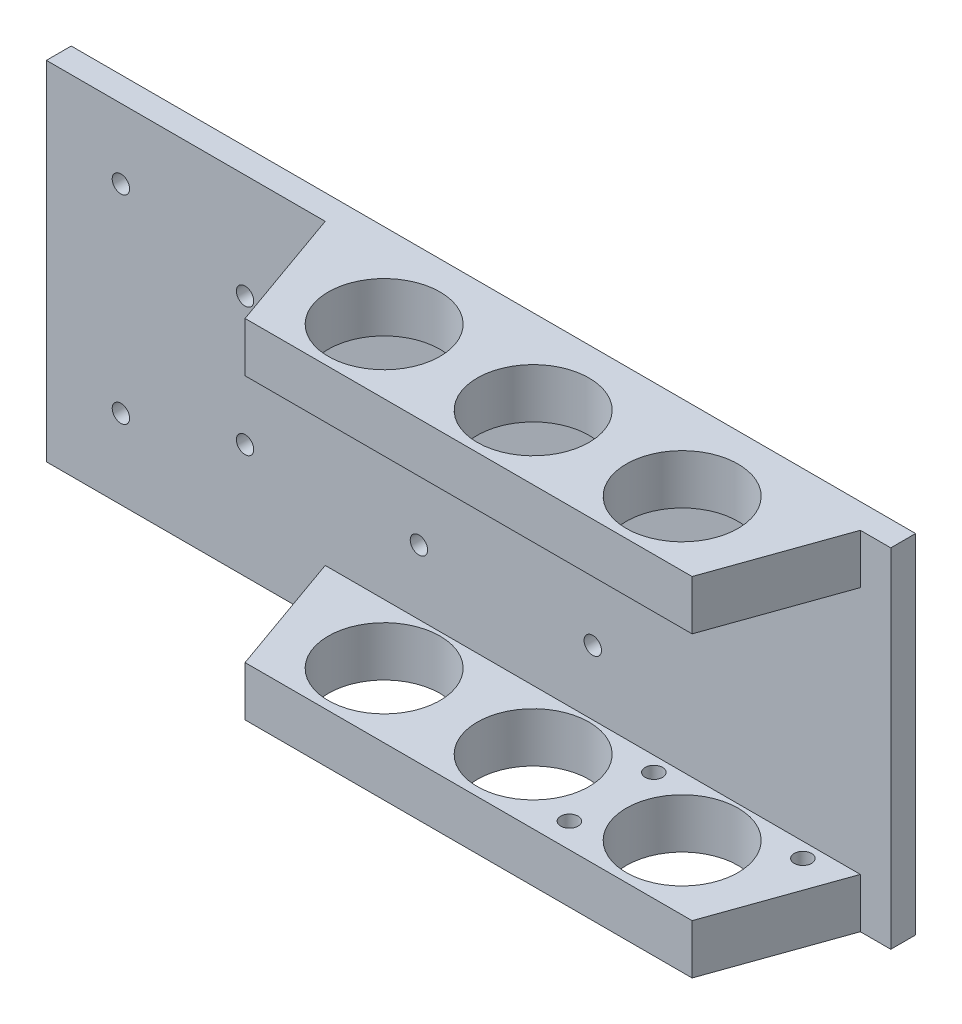
ISO-10303-21;
HEADER;
FILE_DESCRIPTION(('STEP AP214'),'2;1');
FILE_NAME('part.step','',(''),(''),'','','');
FILE_SCHEMA(('AUTOMOTIVE_DESIGN { 1 0 10303 214 1 1 1 1 }'));
ENDSEC;
DATA;
#1=APPLICATION_CONTEXT('core data for automotive mechanical design processes');
#2=APPLICATION_PROTOCOL_DEFINITION('international standard','automotive_design',2000,#1);
#3=PRODUCT_CONTEXT('',#1,'mechanical');
#4=PRODUCT('Part','Part','',(#3));
#5=PRODUCT_RELATED_PRODUCT_CATEGORY('part','',(#4));
#6=PRODUCT_DEFINITION_FORMATION('','',#4);
#7=PRODUCT_DEFINITION_CONTEXT('part definition',#1,'design');
#8=PRODUCT_DEFINITION('design','',#6,#7);
#9=PRODUCT_DEFINITION_SHAPE('','',#8);
#10=(LENGTH_UNIT() NAMED_UNIT(*) SI_UNIT(.MILLI.,.METRE.));
#11=(NAMED_UNIT(*) PLANE_ANGLE_UNIT() SI_UNIT($,.RADIAN.));
#12=(NAMED_UNIT(*) SI_UNIT($,.STERADIAN.) SOLID_ANGLE_UNIT());
#13=UNCERTAINTY_MEASURE_WITH_UNIT(LENGTH_MEASURE(1.E-05),#10,'distance_accuracy_value','');
#14=(GEOMETRIC_REPRESENTATION_CONTEXT(3) GLOBAL_UNCERTAINTY_ASSIGNED_CONTEXT((#13)) GLOBAL_UNIT_ASSIGNED_CONTEXT((#10,
#11,#12)) REPRESENTATION_CONTEXT('',''));
#15=CARTESIAN_POINT('',(0.,0.,0.));
#16=DIRECTION('',(0.,0.,1.));
#17=DIRECTION('',(1.,0.,0.));
#18=AXIS2_PLACEMENT_3D('',#15,#16,#17);
#19=CARTESIAN_POINT('',(-53.8704428508277,35.,2.5));
#20=DIRECTION('',(0.942433981333978,0.,-0.334392270884044));
#21=DIRECTION('',(-0.334392270884044,0.,-0.942433981333978));
#22=AXIS2_PLACEMENT_3D('',#19,#20,#21);
#23=PLANE('',#22);
#24=DIRECTION('',(0.,-1.,0.));
#25=VECTOR('',#24,1.);
#26=CARTESIAN_POINT('',(-53.8704428508277,35.,2.5));
#27=LINE('',#26,#25);
#28=CARTESIAN_POINT('',(-53.8704428508277,35.,2.5));
#29=VERTEX_POINT('',#28);
#30=CARTESIAN_POINT('',(-53.8704428508277,25.,2.50000000000015));
#31=VERTEX_POINT('',#30);
#32=EDGE_CURVE('E52',#29,#31,#27,.T.);
#33=ORIENTED_EDGE('',*,*,#32,.T.);
#34=DIRECTION('',(0.334392270884044,0.,0.942433981333978));
#35=VECTOR('',#34,1.);
#36=CARTESIAN_POINT('',(-53.8704428508277,25.,2.5));
#37=LINE('',#36,#35);
#38=CARTESIAN_POINT('',(-45.,25.,27.5000000000001));
#39=VERTEX_POINT('',#38);
#40=EDGE_CURVE('E257',#31,#39,#37,.T.);
#41=ORIENTED_EDGE('',*,*,#40,.T.);
#42=DIRECTION('',(0.,-1.,0.));
#43=VECTOR('',#42,1.);
#44=CARTESIAN_POINT('',(-45.,35.,27.5));
#45=LINE('',#44,#43);
#46=CARTESIAN_POINT('',(-45.,35.,27.5));
#47=VERTEX_POINT('',#46);
#48=EDGE_CURVE('E169',#47,#39,#45,.T.);
#49=ORIENTED_EDGE('',*,*,#48,.F.);
#50=DIRECTION('',(0.334392270884044,0.,0.942433981333978));
#51=VECTOR('',#50,1.);
#52=CARTESIAN_POINT('',(-53.8704428508277,35.,2.5));
#53=LINE('',#52,#51);
#54=EDGE_CURVE('E121',#29,#47,#53,.T.);
#55=ORIENTED_EDGE('',*,*,#54,.F.);
#56=EDGE_LOOP('',(#33,#41,#49,#55));
#57=FACE_BOUND('',#56,.T.);
#58=ADVANCED_FACE('F43',(#57),#23,.F.);
#59=CARTESIAN_POINT('',(45.,35.,27.5));
#60=DIRECTION('',(0.,0.,-1.));
#61=DIRECTION('',(-1.,0.,0.));
#62=AXIS2_PLACEMENT_3D('',#59,#60,#61);
#63=PLANE('',#62);
#64=ORIENTED_EDGE('',*,*,#48,.T.);
#65=DIRECTION('',(-1.,0.,0.));
#66=VECTOR('',#65,1.);
#67=CARTESIAN_POINT('',(59.9999999999999,25.,27.4999999999998));
#68=LINE('',#67,#66);
#69=CARTESIAN_POINT('',(45.,25.,27.4999999999999));
#70=VERTEX_POINT('',#69);
#71=EDGE_CURVE('E132',#70,#39,#68,.T.);
#72=ORIENTED_EDGE('',*,*,#71,.F.);
#73=DIRECTION('',(0.,-1.,0.));
#74=VECTOR('',#73,1.);
#75=CARTESIAN_POINT('',(45.,35.,27.5));
#76=LINE('',#75,#74);
#77=CARTESIAN_POINT('',(45.,35.,27.5));
#78=VERTEX_POINT('',#77);
#79=EDGE_CURVE('E128',#78,#70,#76,.T.);
#80=ORIENTED_EDGE('',*,*,#79,.F.);
#81=DIRECTION('',(1.,0.,0.));
#82=VECTOR('',#81,1.);
#83=CARTESIAN_POINT('',(45.,35.,27.5));
#84=LINE('',#83,#82);
#85=EDGE_CURVE('E113',#47,#78,#84,.T.);
#86=ORIENTED_EDGE('',*,*,#85,.F.);
#87=EDGE_LOOP('',(#64,#72,#80,#86));
#88=FACE_BOUND('',#87,.T.);
#89=ADVANCED_FACE('F129',(#88),#63,.F.);
#90=CARTESIAN_POINT('',(53.8704428508277,35.,2.49999999999998));
#91=DIRECTION('',(-0.942433981333978,0.,-0.334392270884044));
#92=DIRECTION('',(-0.334392270884044,0.,0.942433981333978));
#93=AXIS2_PLACEMENT_3D('',#90,#91,#92);
#94=PLANE('',#93);
#95=ORIENTED_EDGE('',*,*,#79,.T.);
#96=DIRECTION('',(0.334392270884044,0.,-0.942433981333978));
#97=VECTOR('',#96,1.);
#98=CARTESIAN_POINT('',(53.8704428508277,25.,2.49999999999998));
#99=LINE('',#98,#97);
#100=CARTESIAN_POINT('',(53.8704428508277,25.,2.49999999999986));
#101=VERTEX_POINT('',#100);
#102=EDGE_CURVE('E255',#70,#101,#99,.T.);
#103=ORIENTED_EDGE('',*,*,#102,.T.);
#104=DIRECTION('',(0.,-1.,0.));
#105=VECTOR('',#104,1.);
#106=CARTESIAN_POINT('',(53.8704428508277,35.,2.49999999999998));
#107=LINE('',#106,#105);
#108=CARTESIAN_POINT('',(53.8704428508277,35.,2.49999999999998));
#109=VERTEX_POINT('',#108);
#110=EDGE_CURVE('E140',#109,#101,#107,.T.);
#111=ORIENTED_EDGE('',*,*,#110,.F.);
#112=DIRECTION('',(0.334392270884044,0.,-0.942433981333978));
#113=VECTOR('',#112,1.);
#114=CARTESIAN_POINT('',(53.8704428508277,35.,2.49999999999998));
#115=LINE('',#114,#113);
#116=EDGE_CURVE('E118',#78,#109,#115,.T.);
#117=ORIENTED_EDGE('',*,*,#116,.F.);
#118=EDGE_LOOP('',(#95,#103,#111,#117));
#119=FACE_BOUND('',#118,.T.);
#120=ADVANCED_FACE('F138',(#119),#94,.F.);
#121=CARTESIAN_POINT('',(0.,35.,14.5));
#122=DIRECTION('',(0.,-1.,0.));
#123=DIRECTION('',(0.,0.,-1.));
#124=AXIS2_PLACEMENT_3D('',#121,#122,#123);
#125=CYLINDRICAL_SURFACE('',#124,11.25);
#126=CARTESIAN_POINT('',(0.,25.,14.5));
#127=DIRECTION('',(0.,1.,0.));
#128=DIRECTION('',(0.,0.,1.));
#129=AXIS2_PLACEMENT_3D('',#126,#127,#128);
#130=CIRCLE('',#129,11.25);
#131=CARTESIAN_POINT('',(0.,25.,25.75));
#132=VERTEX_POINT('',#131);
#133=EDGE_CURVE('E252',#132,#132,#130,.T.);
#134=ORIENTED_EDGE('',*,*,#133,.F.);
#135=EDGE_LOOP('',(#134));
#136=FACE_BOUND('',#135,.T.);
#137=CARTESIAN_POINT('',(0.,35.,14.5));
#138=DIRECTION('',(0.,1.,0.));
#139=DIRECTION('',(0.,0.,1.));
#140=AXIS2_PLACEMENT_3D('',#137,#138,#139);
#141=CIRCLE('',#140,11.25);
#142=CARTESIAN_POINT('',(0.,35.,25.75));
#143=VERTEX_POINT('',#142);
#144=EDGE_CURVE('E148',#143,#143,#141,.T.);
#145=ORIENTED_EDGE('',*,*,#144,.T.);
#146=EDGE_LOOP('',(#145));
#147=FACE_BOUND('',#146,.T.);
#148=ADVANCED_FACE('F361',(#136,#147),#125,.F.);
#149=CARTESIAN_POINT('',(30.,35.,14.5));
#150=DIRECTION('',(0.,-1.,0.));
#151=DIRECTION('',(0.,0.,-1.));
#152=AXIS2_PLACEMENT_3D('',#149,#150,#151);
#153=CYLINDRICAL_SURFACE('',#152,11.25);
#154=CARTESIAN_POINT('',(30.,25.,14.5));
#155=DIRECTION('',(0.,1.,0.));
#156=DIRECTION('',(0.,0.,1.));
#157=AXIS2_PLACEMENT_3D('',#154,#155,#156);
#158=CIRCLE('',#157,11.25);
#159=CARTESIAN_POINT('',(30.,25.,25.75));
#160=VERTEX_POINT('',#159);
#161=EDGE_CURVE('E181',#160,#160,#158,.T.);
#162=ORIENTED_EDGE('',*,*,#161,.F.);
#163=EDGE_LOOP('',(#162));
#164=FACE_BOUND('',#163,.T.);
#165=CARTESIAN_POINT('',(30.,35.,14.5));
#166=DIRECTION('',(0.,1.,0.));
#167=DIRECTION('',(0.,0.,1.));
#168=AXIS2_PLACEMENT_3D('',#165,#166,#167);
#169=CIRCLE('',#168,11.25);
#170=CARTESIAN_POINT('',(30.,35.,25.75));
#171=VERTEX_POINT('',#170);
#172=EDGE_CURVE('E267',#171,#171,#169,.T.);
#173=ORIENTED_EDGE('',*,*,#172,.T.);
#174=EDGE_LOOP('',(#173));
#175=FACE_BOUND('',#174,.T.);
#176=ADVANCED_FACE('F365',(#164,#175),#153,.F.);
#177=CARTESIAN_POINT('',(-30.,35.,14.5));
#178=DIRECTION('',(0.,-1.,0.));
#179=DIRECTION('',(0.,0.,-1.));
#180=AXIS2_PLACEMENT_3D('',#177,#178,#179);
#181=CYLINDRICAL_SURFACE('',#180,11.25);
#182=CARTESIAN_POINT('',(-30.,25.,14.5));
#183=DIRECTION('',(0.,1.,0.));
#184=DIRECTION('',(0.,0.,1.));
#185=AXIS2_PLACEMENT_3D('',#182,#183,#184);
#186=CIRCLE('',#185,11.25);
#187=CARTESIAN_POINT('',(-30.,25.,25.75));
#188=VERTEX_POINT('',#187);
#189=EDGE_CURVE('E178',#188,#188,#186,.T.);
#190=ORIENTED_EDGE('',*,*,#189,.F.);
#191=EDGE_LOOP('',(#190));
#192=FACE_BOUND('',#191,.T.);
#193=CARTESIAN_POINT('',(-30.,35.,14.5));
#194=DIRECTION('',(0.,1.,0.));
#195=DIRECTION('',(0.,0.,-1.));
#196=AXIS2_PLACEMENT_3D('',#193,#194,#195);
#197=CIRCLE('',#196,11.25);
#198=CARTESIAN_POINT('',(-30.,35.,3.25000000000002));
#199=VERTEX_POINT('',#198);
#200=EDGE_CURVE('E261',#199,#199,#197,.T.);
#201=ORIENTED_EDGE('',*,*,#200,.T.);
#202=EDGE_LOOP('',(#201));
#203=FACE_BOUND('',#202,.T.);
#204=ADVANCED_FACE('F371',(#192,#203),#181,.F.);
#205=CARTESIAN_POINT('',(0.,35.,0.));
#206=DIRECTION('',(0.,-1.,0.));
#207=DIRECTION('',(0.,0.,-1.));
#208=AXIS2_PLACEMENT_3D('',#205,#206,#207);
#209=PLANE('',#208);
#210=DIRECTION('',(0.,0.,-1.));
#211=VECTOR('',#210,1.);
#212=CARTESIAN_POINT('',(59.9999999999998,35.,2.49999999999997));
#213=LINE('',#212,#211);
#214=CARTESIAN_POINT('',(59.9999999999998,35.,2.49999999999997));
#215=VERTEX_POINT('',#214);
#216=CARTESIAN_POINT('',(59.9999999999998,35.,-2.49999999999999));
#217=VERTEX_POINT('',#216);
#218=EDGE_CURVE('E165',#215,#217,#213,.T.);
#219=ORIENTED_EDGE('',*,*,#218,.T.);
#220=DIRECTION('',(-1.,0.,0.));
#221=VECTOR('',#220,1.);
#222=CARTESIAN_POINT('',(-60.0000000000002,35.,-2.49999999999999));
#223=LINE('',#222,#221);
#224=CARTESIAN_POINT('',(-110.,35.,-2.5));
#225=VERTEX_POINT('',#224);
#226=EDGE_CURVE('E103',#217,#225,#223,.T.);
#227=ORIENTED_EDGE('',*,*,#226,.T.);
#228=DIRECTION('',(0.,0.,-1.));
#229=VECTOR('',#228,1.);
#230=CARTESIAN_POINT('',(-110.,35.,2.5));
#231=LINE('',#230,#229);
#232=CARTESIAN_POINT('',(-110.,35.,2.5));
#233=VERTEX_POINT('',#232);
#234=EDGE_CURVE('E222',#233,#225,#231,.T.);
#235=ORIENTED_EDGE('',*,*,#234,.F.);
#236=DIRECTION('',(1.,0.,0.));
#237=VECTOR('',#236,1.);
#238=CARTESIAN_POINT('',(-60.0000000000002,35.,2.50000000000001));
#239=LINE('',#238,#237);
#240=EDGE_CURVE('E279',#233,#29,#239,.T.);
#241=ORIENTED_EDGE('',*,*,#240,.T.);
#242=ORIENTED_EDGE('',*,*,#54,.T.);
#243=ORIENTED_EDGE('',*,*,#85,.T.);
#244=ORIENTED_EDGE('',*,*,#116,.T.);
#245=DIRECTION('',(1.,0.,0.));
#246=VECTOR('',#245,1.);
#247=CARTESIAN_POINT('',(53.8704428508277,35.,2.49999999999998));
#248=LINE('',#247,#246);
#249=EDGE_CURVE('E69',#109,#215,#248,.T.);
#250=ORIENTED_EDGE('',*,*,#249,.T.);
#251=EDGE_LOOP('',(#219,#227,#235,#241,#242,#243,#244,#250));
#252=FACE_BOUND('',#251,.T.);
#253=ORIENTED_EDGE('',*,*,#144,.F.);
#254=EDGE_LOOP('',(#253));
#255=FACE_BOUND('',#254,.T.);
#256=ORIENTED_EDGE('',*,*,#172,.F.);
#257=EDGE_LOOP('',(#256));
#258=FACE_BOUND('',#257,.T.);
#259=ORIENTED_EDGE('',*,*,#200,.F.);
#260=EDGE_LOOP('',(#259));
#261=FACE_BOUND('',#260,.T.);
#262=ADVANCED_FACE('F115',(#252,#255,#258,#261),#209,.F.);
#263=CARTESIAN_POINT('',(0.,-35.,0.));
#264=DIRECTION('',(0.,-1.,0.));
#265=DIRECTION('',(0.,0.,-1.));
#266=AXIS2_PLACEMENT_3D('',#263,#264,#265);
#267=PLANE('',#266);
#268=CARTESIAN_POINT('',(45.2999999999998,-35.,5.50000000000002));
#269=DIRECTION('',(0.,-1.,0.));
#270=DIRECTION('',(0.,0.,-1.));
#271=AXIS2_PLACEMENT_3D('',#268,#269,#270);
#272=CIRCLE('',#271,1.75);
#273=CARTESIAN_POINT('',(45.2999999999998,-35.,3.75000000000002));
#274=VERTEX_POINT('',#273);
#275=EDGE_CURVE('E799',#274,#274,#272,.T.);
#276=ORIENTED_EDGE('',*,*,#275,.F.);
#277=EDGE_LOOP('',(#276));
#278=FACE_BOUND('',#277,.T.);
#279=CARTESIAN_POINT('',(15.2999999999998,-35.,22.5));
#280=DIRECTION('',(0.,-1.,0.));
#281=DIRECTION('',(0.,0.,-1.));
#282=AXIS2_PLACEMENT_3D('',#279,#280,#281);
#283=CIRCLE('',#282,1.75);
#284=CARTESIAN_POINT('',(15.2999999999998,-35.,20.75));
#285=VERTEX_POINT('',#284);
#286=EDGE_CURVE('E802',#285,#285,#283,.T.);
#287=ORIENTED_EDGE('',*,*,#286,.F.);
#288=EDGE_LOOP('',(#287));
#289=FACE_BOUND('',#288,.T.);
#290=CARTESIAN_POINT('',(15.2999999999998,-35.,5.50000000000002));
#291=DIRECTION('',(0.,-1.,0.));
#292=DIRECTION('',(0.,0.,-1.));
#293=AXIS2_PLACEMENT_3D('',#290,#291,#292);
#294=CIRCLE('',#293,1.75);
#295=CARTESIAN_POINT('',(15.2999999999998,-35.,3.75000000000002));
#296=VERTEX_POINT('',#295);
#297=EDGE_CURVE('E210',#296,#296,#294,.T.);
#298=ORIENTED_EDGE('',*,*,#297,.F.);
#299=EDGE_LOOP('',(#298));
#300=FACE_BOUND('',#299,.T.);
#301=CARTESIAN_POINT('',(30.,-35.,14.5));
#302=DIRECTION('',(0.,1.,0.));
#303=DIRECTION('',(0.,0.,1.));
#304=AXIS2_PLACEMENT_3D('',#301,#302,#303);
#305=CIRCLE('',#304,11.25);
#306=CARTESIAN_POINT('',(30.,-35.,25.75));
#307=VERTEX_POINT('',#306);
#308=EDGE_CURVE('E264',#307,#307,#305,.T.);
#309=ORIENTED_EDGE('',*,*,#308,.T.);
#310=EDGE_LOOP('',(#309));
#311=FACE_BOUND('',#310,.T.);
#312=DIRECTION('',(0.,0.,-1.));
#313=VECTOR('',#312,1.);
#314=CARTESIAN_POINT('',(59.9999999999998,-35.,2.49999999999997));
#315=LINE('',#314,#313);
#316=CARTESIAN_POINT('',(59.9999999999998,-35.,2.49999999999997));
#317=VERTEX_POINT('',#316);
#318=CARTESIAN_POINT('',(59.9999999999998,-35.,-2.49999999999999));
#319=VERTEX_POINT('',#318);
#320=EDGE_CURVE('E145',#317,#319,#315,.T.);
#321=ORIENTED_EDGE('',*,*,#320,.F.);
#322=DIRECTION('',(1.,0.,0.));
#323=VECTOR('',#322,1.);
#324=CARTESIAN_POINT('',(53.8704428508277,-35.,2.49999999999998));
#325=LINE('',#324,#323);
#326=CARTESIAN_POINT('',(53.8704428508277,-35.,2.49999999999998));
#327=VERTEX_POINT('',#326);
#328=EDGE_CURVE('E163',#327,#317,#325,.T.);
#329=ORIENTED_EDGE('',*,*,#328,.F.);
#330=DIRECTION('',(0.334392270884044,0.,-0.942433981333978));
#331=VECTOR('',#330,1.);
#332=CARTESIAN_POINT('',(53.8704428508277,-35.,2.49999999999998));
#333=LINE('',#332,#331);
#334=CARTESIAN_POINT('',(45.,-35.,27.5));
#335=VERTEX_POINT('',#334);
#336=EDGE_CURVE('E160',#335,#327,#333,.T.);
#337=ORIENTED_EDGE('',*,*,#336,.F.);
#338=DIRECTION('',(1.,0.,0.));
#339=VECTOR('',#338,1.);
#340=CARTESIAN_POINT('',(45.,-35.,27.5));
#341=LINE('',#340,#339);
#342=CARTESIAN_POINT('',(-45.,-35.,27.5));
#343=VERTEX_POINT('',#342);
#344=EDGE_CURVE('E157',#343,#335,#341,.T.);
#345=ORIENTED_EDGE('',*,*,#344,.F.);
#346=DIRECTION('',(0.334392270884044,0.,0.942433981333978));
#347=VECTOR('',#346,1.);
#348=CARTESIAN_POINT('',(-53.8704428508277,-35.,2.5));
#349=LINE('',#348,#347);
#350=CARTESIAN_POINT('',(-53.8704428508277,-35.,2.5));
#351=VERTEX_POINT('',#350);
#352=EDGE_CURVE('E154',#351,#343,#349,.T.);
#353=ORIENTED_EDGE('',*,*,#352,.F.);
#354=DIRECTION('',(1.,0.,0.));
#355=VECTOR('',#354,1.);
#356=CARTESIAN_POINT('',(-60.0000000000002,-35.,2.50000000000001));
#357=LINE('',#356,#355);
#358=CARTESIAN_POINT('',(-110.,-35.,2.5));
#359=VERTEX_POINT('',#358);
#360=EDGE_CURVE('E151',#359,#351,#357,.T.);
#361=ORIENTED_EDGE('',*,*,#360,.F.);
#362=DIRECTION('',(0.,0.,-1.));
#363=VECTOR('',#362,1.);
#364=CARTESIAN_POINT('',(-110.,-35.,2.5));
#365=LINE('',#364,#363);
#366=CARTESIAN_POINT('',(-110.,-35.,-2.5));
#367=VERTEX_POINT('',#366);
#368=EDGE_CURVE('E227',#359,#367,#365,.T.);
#369=ORIENTED_EDGE('',*,*,#368,.T.);
#370=DIRECTION('',(-1.,0.,0.));
#371=VECTOR('',#370,1.);
#372=CARTESIAN_POINT('',(-60.0000000000002,-35.,-2.49999999999999));
#373=LINE('',#372,#371);
#374=EDGE_CURVE('E147',#319,#367,#373,.T.);
#375=ORIENTED_EDGE('',*,*,#374,.F.);
#376=EDGE_LOOP('',(#321,#329,#337,#345,#353,#361,#369,#375));
#377=FACE_BOUND('',#376,.T.);
#378=CARTESIAN_POINT('',(0.,-35.,14.5));
#379=DIRECTION('',(0.,1.,0.));
#380=DIRECTION('',(0.,0.,1.));
#381=AXIS2_PLACEMENT_3D('',#378,#379,#380);
#382=CIRCLE('',#381,11.25);
#383=CARTESIAN_POINT('',(0.,-35.,25.75));
#384=VERTEX_POINT('',#383);
#385=EDGE_CURVE('E270',#384,#384,#382,.T.);
#386=ORIENTED_EDGE('',*,*,#385,.T.);
#387=EDGE_LOOP('',(#386));
#388=FACE_BOUND('',#387,.T.);
#389=CARTESIAN_POINT('',(-30.,-35.,14.5));
#390=DIRECTION('',(0.,1.,0.));
#391=DIRECTION('',(0.,0.,-1.));
#392=AXIS2_PLACEMENT_3D('',#389,#390,#391);
#393=CIRCLE('',#392,11.25);
#394=CARTESIAN_POINT('',(-30.,-35.,3.25000000000002));
#395=VERTEX_POINT('',#394);
#396=EDGE_CURVE('E260',#395,#395,#393,.T.);
#397=ORIENTED_EDGE('',*,*,#396,.T.);
#398=EDGE_LOOP('',(#397));
#399=FACE_BOUND('',#398,.T.);
#400=ADVANCED_FACE('F314',(#278,#289,#300,#311,#377,#388,#399),#267,.T.);
#401=CARTESIAN_POINT('',(59.9999999999998,35.,2.49999999999997));
#402=DIRECTION('',(-1.,0.,0.));
#403=DIRECTION('',(0.,0.,1.));
#404=AXIS2_PLACEMENT_3D('',#401,#402,#403);
#405=PLANE('',#404);
#406=ORIENTED_EDGE('',*,*,#320,.T.);
#407=DIRECTION('',(0.,-1.,0.));
#408=VECTOR('',#407,1.);
#409=CARTESIAN_POINT('',(59.9999999999998,35.,-2.49999999999999));
#410=LINE('',#409,#408);
#411=EDGE_CURVE('E11',#217,#319,#410,.T.);
#412=ORIENTED_EDGE('',*,*,#411,.F.);
#413=ORIENTED_EDGE('',*,*,#218,.F.);
#414=DIRECTION('',(0.,-1.,0.));
#415=VECTOR('',#414,1.);
#416=CARTESIAN_POINT('',(59.9999999999998,35.,2.49999999999997));
#417=LINE('',#416,#415);
#418=EDGE_CURVE('E95',#215,#317,#417,.T.);
#419=ORIENTED_EDGE('',*,*,#418,.T.);
#420=EDGE_LOOP('',(#406,#412,#413,#419));
#421=FACE_BOUND('',#420,.T.);
#422=ADVANCED_FACE('F45',(#421),#405,.F.);
#423=CARTESIAN_POINT('',(-60.0000000000002,35.,-2.49999999999999));
#424=DIRECTION('',(0.,0.,1.));
#425=DIRECTION('',(1.,0.,0.));
#426=AXIS2_PLACEMENT_3D('',#423,#424,#425);
#427=PLANE('',#426);
#428=CARTESIAN_POINT('',(-35.0000000000002,-12.,-2.5));
#429=DIRECTION('',(0.,0.,-1.));
#430=DIRECTION('',(-1.,0.,0.));
#431=AXIS2_PLACEMENT_3D('',#428,#429,#430);
#432=CIRCLE('',#431,1.75);
#433=CARTESIAN_POINT('',(-36.7500000000002,-12.,-2.5));
#434=VERTEX_POINT('',#433);
#435=EDGE_CURVE('E779',#434,#434,#432,.T.);
#436=ORIENTED_EDGE('',*,*,#435,.F.);
#437=EDGE_LOOP('',(#436));
#438=FACE_BOUND('',#437,.T.);
#439=CARTESIAN_POINT('',(-70.0000000000002,-12.,-2.5));
#440=DIRECTION('',(0.,0.,-1.));
#441=DIRECTION('',(-1.,0.,0.));
#442=AXIS2_PLACEMENT_3D('',#439,#440,#441);
#443=CIRCLE('',#442,1.75);
#444=CARTESIAN_POINT('',(-71.7500000000002,-12.,-2.5));
#445=VERTEX_POINT('',#444);
#446=EDGE_CURVE('E780',#445,#445,#443,.T.);
#447=ORIENTED_EDGE('',*,*,#446,.F.);
#448=EDGE_LOOP('',(#447));
#449=FACE_BOUND('',#448,.T.);
#450=CARTESIAN_POINT('',(-35.0000000000001,13.91,-2.5));
#451=DIRECTION('',(0.,0.,-1.));
#452=DIRECTION('',(-1.,0.,0.));
#453=AXIS2_PLACEMENT_3D('',#450,#451,#452);
#454=CIRCLE('',#453,1.75);
#455=CARTESIAN_POINT('',(-36.7500000000001,13.91,-2.5));
#456=VERTEX_POINT('',#455);
#457=EDGE_CURVE('E785',#456,#456,#454,.T.);
#458=ORIENTED_EDGE('',*,*,#457,.F.);
#459=EDGE_LOOP('',(#458));
#460=FACE_BOUND('',#459,.T.);
#461=CARTESIAN_POINT('',(-70.0000000000001,13.91,-2.5));
#462=DIRECTION('',(0.,0.,-1.));
#463=DIRECTION('',(-1.,0.,0.));
#464=AXIS2_PLACEMENT_3D('',#461,#462,#463);
#465=CIRCLE('',#464,1.75);
#466=CARTESIAN_POINT('',(-71.7500000000001,13.91,-2.5));
#467=VERTEX_POINT('',#466);
#468=EDGE_CURVE('E793',#467,#467,#465,.T.);
#469=ORIENTED_EDGE('',*,*,#468,.F.);
#470=EDGE_LOOP('',(#469));
#471=FACE_BOUND('',#470,.T.);
#472=CARTESIAN_POINT('',(-1.19858550168273E-13,13.91,-2.5));
#473=DIRECTION('',(0.,0.,-1.));
#474=DIRECTION('',(-1.,0.,0.));
#475=AXIS2_PLACEMENT_3D('',#472,#473,#474);
#476=CIRCLE('',#475,1.75);
#477=CARTESIAN_POINT('',(-1.75000000000012,13.91,-2.5));
#478=VERTEX_POINT('',#477);
#479=EDGE_CURVE('E795',#478,#478,#476,.T.);
#480=ORIENTED_EDGE('',*,*,#479,.F.);
#481=EDGE_LOOP('',(#480));
#482=FACE_BOUND('',#481,.T.);
#483=CARTESIAN_POINT('',(-95.0000000000002,20.955,-2.5));
#484=DIRECTION('',(0.,0.,-1.));
#485=DIRECTION('',(-1.,0.,0.));
#486=AXIS2_PLACEMENT_3D('',#483,#484,#485);
#487=CIRCLE('',#486,1.75);
#488=CARTESIAN_POINT('',(-96.7500000000002,20.955,-2.5));
#489=VERTEX_POINT('',#488);
#490=EDGE_CURVE('E825',#489,#489,#487,.T.);
#491=ORIENTED_EDGE('',*,*,#490,.F.);
#492=EDGE_LOOP('',(#491));
#493=FACE_BOUND('',#492,.T.);
#494=CARTESIAN_POINT('',(-95.0000000000002,-19.045,-2.5));
#495=DIRECTION('',(0.,0.,-1.));
#496=DIRECTION('',(-1.,0.,0.));
#497=AXIS2_PLACEMENT_3D('',#494,#495,#496);
#498=CIRCLE('',#497,1.75);
#499=CARTESIAN_POINT('',(-96.7500000000002,-19.045,-2.5));
#500=VERTEX_POINT('',#499);
#501=EDGE_CURVE('E788',#500,#500,#498,.T.);
#502=ORIENTED_EDGE('',*,*,#501,.F.);
#503=EDGE_LOOP('',(#502));
#504=FACE_BOUND('',#503,.T.);
#505=CARTESIAN_POINT('',(-2.09196809181078E-13,-12.,-2.5));
#506=DIRECTION('',(0.,0.,-1.));
#507=DIRECTION('',(-1.,0.,0.));
#508=AXIS2_PLACEMENT_3D('',#505,#506,#507);
#509=CIRCLE('',#508,1.75);
#510=CARTESIAN_POINT('',(-1.75000000000021,-12.,-2.5));
#511=VERTEX_POINT('',#510);
#512=EDGE_CURVE('E187',#511,#511,#509,.T.);
#513=ORIENTED_EDGE('',*,*,#512,.F.);
#514=EDGE_LOOP('',(#513));
#515=FACE_BOUND('',#514,.T.);
#516=ORIENTED_EDGE('',*,*,#374,.T.);
#517=DIRECTION('',(0.,-1.,0.));
#518=VECTOR('',#517,1.);
#519=CARTESIAN_POINT('',(-110.,0.,-2.5));
#520=LINE('',#519,#518);
#521=EDGE_CURVE('E223',#225,#367,#520,.T.);
#522=ORIENTED_EDGE('',*,*,#521,.F.);
#523=ORIENTED_EDGE('',*,*,#226,.F.);
#524=ORIENTED_EDGE('',*,*,#411,.T.);
#525=EDGE_LOOP('',(#516,#522,#523,#524));
#526=FACE_BOUND('',#525,.T.);
#527=ADVANCED_FACE('F320',(#438,#449,#460,#471,#482,#493,#504,#515,#526),#427,.F.);
#528=CARTESIAN_POINT('',(-45.,-25.,27.5000000000001));
#529=VERTEX_POINT('',#528);
#530=EDGE_CURVE('E135',#529,#343,#45,.T.);
#531=ORIENTED_EDGE('',*,*,#530,.F.);
#532=DIRECTION('',(-0.334392270884044,0.,-0.942433981333978));
#533=VECTOR('',#532,1.);
#534=CARTESIAN_POINT('',(-53.8704428508277,-25.,2.5));
#535=LINE('',#534,#533);
#536=CARTESIAN_POINT('',(-53.8704428508277,-25.,2.50000000000015));
#537=VERTEX_POINT('',#536);
#538=EDGE_CURVE('E182',#529,#537,#535,.T.);
#539=ORIENTED_EDGE('',*,*,#538,.T.);
#540=EDGE_CURVE('E171',#537,#351,#27,.T.);
#541=ORIENTED_EDGE('',*,*,#540,.T.);
#542=ORIENTED_EDGE('',*,*,#352,.T.);
#543=EDGE_LOOP('',(#531,#539,#541,#542));
#544=FACE_BOUND('',#543,.T.);
#545=ADVANCED_FACE('F329',(#544),#23,.F.);
#546=CARTESIAN_POINT('',(45.,-25.,27.4999999999999));
#547=VERTEX_POINT('',#546);
#548=EDGE_CURVE('E136',#547,#335,#76,.T.);
#549=ORIENTED_EDGE('',*,*,#548,.F.);
#550=DIRECTION('',(-1.,0.,0.));
#551=VECTOR('',#550,1.);
#552=CARTESIAN_POINT('',(59.9999999999999,-25.,27.4999999999998));
#553=LINE('',#552,#551);
#554=EDGE_CURVE('E234',#547,#529,#553,.T.);
#555=ORIENTED_EDGE('',*,*,#554,.T.);
#556=ORIENTED_EDGE('',*,*,#530,.T.);
#557=ORIENTED_EDGE('',*,*,#344,.T.);
#558=EDGE_LOOP('',(#549,#555,#556,#557));
#559=FACE_BOUND('',#558,.T.);
#560=ADVANCED_FACE('F339',(#559),#63,.F.);
#561=CARTESIAN_POINT('',(53.8704428508277,-25.,2.49999999999998));
#562=VERTEX_POINT('',#561);
#563=EDGE_CURVE('E167',#562,#327,#107,.T.);
#564=ORIENTED_EDGE('',*,*,#563,.F.);
#565=DIRECTION('',(-0.334392270884044,0.,0.942433981333978));
#566=VECTOR('',#565,1.);
#567=CARTESIAN_POINT('',(53.8704428508277,-25.,2.49999999999998));
#568=LINE('',#567,#566);
#569=EDGE_CURVE('E245',#562,#547,#568,.T.);
#570=ORIENTED_EDGE('',*,*,#569,.T.);
#571=ORIENTED_EDGE('',*,*,#548,.T.);
#572=ORIENTED_EDGE('',*,*,#336,.T.);
#573=EDGE_LOOP('',(#564,#570,#571,#572));
#574=FACE_BOUND('',#573,.T.);
#575=ADVANCED_FACE('F345',(#574),#94,.F.);
#576=CARTESIAN_POINT('',(53.8704428508277,35.,2.49999999999998));
#577=DIRECTION('',(0.,0.,-1.));
#578=DIRECTION('',(-1.,0.,0.));
#579=AXIS2_PLACEMENT_3D('',#576,#577,#578);
#580=PLANE('',#579);
#581=CARTESIAN_POINT('',(-35.0000000000002,-12.,2.50000000000012));
#582=DIRECTION('',(0.,0.,-1.));
#583=DIRECTION('',(-1.,0.,0.));
#584=AXIS2_PLACEMENT_3D('',#581,#582,#583);
#585=CIRCLE('',#584,1.75);
#586=CARTESIAN_POINT('',(-36.7500000000002,-12.,2.50000000000012));
#587=VERTEX_POINT('',#586);
#588=EDGE_CURVE('E47',#587,#587,#585,.T.);
#589=ORIENTED_EDGE('',*,*,#588,.T.);
#590=EDGE_LOOP('',(#589));
#591=FACE_BOUND('',#590,.T.);
#592=CARTESIAN_POINT('',(-70.0000000000002,-12.,2.50000000000018));
#593=DIRECTION('',(0.,0.,-1.));
#594=DIRECTION('',(-1.,0.,0.));
#595=AXIS2_PLACEMENT_3D('',#592,#593,#594);
#596=CIRCLE('',#595,1.75);
#597=CARTESIAN_POINT('',(-71.7500000000002,-12.,2.50000000000018));
#598=VERTEX_POINT('',#597);
#599=EDGE_CURVE('E201',#598,#598,#596,.T.);
#600=ORIENTED_EDGE('',*,*,#599,.T.);
#601=EDGE_LOOP('',(#600));
#602=FACE_BOUND('',#601,.T.);
#603=CARTESIAN_POINT('',(-35.0000000000001,13.91,2.50000000000012));
#604=DIRECTION('',(0.,0.,-1.));
#605=DIRECTION('',(-1.,0.,0.));
#606=AXIS2_PLACEMENT_3D('',#603,#604,#605);
#607=CIRCLE('',#606,1.75);
#608=CARTESIAN_POINT('',(-36.7500000000001,13.91,2.50000000000012));
#609=VERTEX_POINT('',#608);
#610=EDGE_CURVE('E199',#609,#609,#607,.T.);
#611=ORIENTED_EDGE('',*,*,#610,.T.);
#612=EDGE_LOOP('',(#611));
#613=FACE_BOUND('',#612,.T.);
#614=CARTESIAN_POINT('',(-70.0000000000001,13.91,2.50000000000018));
#615=DIRECTION('',(0.,0.,-1.));
#616=DIRECTION('',(-1.,0.,0.));
#617=AXIS2_PLACEMENT_3D('',#614,#615,#616);
#618=CIRCLE('',#617,1.75);
#619=CARTESIAN_POINT('',(-71.7500000000001,13.91,2.50000000000018));
#620=VERTEX_POINT('',#619);
#621=EDGE_CURVE('E196',#620,#620,#618,.T.);
#622=ORIENTED_EDGE('',*,*,#621,.T.);
#623=EDGE_LOOP('',(#622));
#624=FACE_BOUND('',#623,.T.);
#625=CARTESIAN_POINT('',(-1.19858550168273E-13,13.91,2.50000000000007));
#626=DIRECTION('',(0.,0.,-1.));
#627=DIRECTION('',(-1.,0.,0.));
#628=AXIS2_PLACEMENT_3D('',#625,#626,#627);
#629=CIRCLE('',#628,1.75);
#630=CARTESIAN_POINT('',(-1.75000000000012,13.91,2.50000000000007));
#631=VERTEX_POINT('',#630);
#632=EDGE_CURVE('E193',#631,#631,#629,.T.);
#633=ORIENTED_EDGE('',*,*,#632,.T.);
#634=EDGE_LOOP('',(#633));
#635=FACE_BOUND('',#634,.T.);
#636=CARTESIAN_POINT('',(-95.0000000000002,20.955,2.50000000000022));
#637=DIRECTION('',(0.,0.,-1.));
#638=DIRECTION('',(-1.,0.,0.));
#639=AXIS2_PLACEMENT_3D('',#636,#637,#638);
#640=CIRCLE('',#639,1.75);
#641=CARTESIAN_POINT('',(-96.7500000000002,20.955,2.50000000000022));
#642=VERTEX_POINT('',#641);
#643=EDGE_CURVE('E190',#642,#642,#640,.T.);
#644=ORIENTED_EDGE('',*,*,#643,.T.);
#645=EDGE_LOOP('',(#644));
#646=FACE_BOUND('',#645,.T.);
#647=CARTESIAN_POINT('',(-95.0000000000002,-19.045,2.50000000000022));
#648=DIRECTION('',(0.,0.,-1.));
#649=DIRECTION('',(-1.,0.,0.));
#650=AXIS2_PLACEMENT_3D('',#647,#648,#649);
#651=CIRCLE('',#650,1.75);
#652=CARTESIAN_POINT('',(-96.7500000000002,-19.045,2.50000000000022));
#653=VERTEX_POINT('',#652);
#654=EDGE_CURVE('E186',#653,#653,#651,.T.);
#655=ORIENTED_EDGE('',*,*,#654,.T.);
#656=EDGE_LOOP('',(#655));
#657=FACE_BOUND('',#656,.T.);
#658=CARTESIAN_POINT('',(-2.09196809181078E-13,-12.,2.50000000000007));
#659=DIRECTION('',(0.,0.,-1.));
#660=DIRECTION('',(-1.,0.,0.));
#661=AXIS2_PLACEMENT_3D('',#658,#659,#660);
#662=CIRCLE('',#661,1.75);
#663=CARTESIAN_POINT('',(-1.75000000000021,-12.,2.50000000000007));
#664=VERTEX_POINT('',#663);
#665=EDGE_CURVE('E183',#664,#664,#662,.T.);
#666=ORIENTED_EDGE('',*,*,#665,.T.);
#667=EDGE_LOOP('',(#666));
#668=FACE_BOUND('',#667,.T.);
#669=ORIENTED_EDGE('',*,*,#328,.T.);
#670=ORIENTED_EDGE('',*,*,#418,.F.);
#671=ORIENTED_EDGE('',*,*,#249,.F.);
#672=ORIENTED_EDGE('',*,*,#110,.T.);
#673=DIRECTION('',(-1.,0.,0.));
#674=VECTOR('',#673,1.);
#675=CARTESIAN_POINT('',(59.9999999999998,25.,2.49999999999984));
#676=LINE('',#675,#674);
#677=EDGE_CURVE('E230',#101,#31,#676,.T.);
#678=ORIENTED_EDGE('',*,*,#677,.T.);
#679=ORIENTED_EDGE('',*,*,#32,.F.);
#680=ORIENTED_EDGE('',*,*,#240,.F.);
#681=DIRECTION('',(0.,-1.,0.));
#682=VECTOR('',#681,1.);
#683=CARTESIAN_POINT('',(-110.,0.,2.5));
#684=LINE('',#683,#682);
#685=EDGE_CURVE('E219',#233,#359,#684,.T.);
#686=ORIENTED_EDGE('',*,*,#685,.T.);
#687=ORIENTED_EDGE('',*,*,#360,.T.);
#688=ORIENTED_EDGE('',*,*,#540,.F.);
#689=DIRECTION('',(-1.,0.,0.));
#690=VECTOR('',#689,1.);
#691=CARTESIAN_POINT('',(59.9999999999998,-25.,2.49999999999984));
#692=LINE('',#691,#690);
#693=EDGE_CURVE('E60',#562,#537,#692,.T.);
#694=ORIENTED_EDGE('',*,*,#693,.F.);
#695=ORIENTED_EDGE('',*,*,#563,.T.);
#696=EDGE_LOOP('',(#669,#670,#671,#672,#678,#679,#680,#686,#687,#688,#694,#695));
#697=FACE_BOUND('',#696,.T.);
#698=ADVANCED_FACE('F285',(#591,#602,#613,#624,#635,#646,#657,#668,#697),#580,.F.);
#699=CARTESIAN_POINT('',(0.,-25.,14.5));
#700=DIRECTION('',(0.,-1.,0.));
#701=DIRECTION('',(0.,0.,-1.));
#702=AXIS2_PLACEMENT_3D('',#699,#700,#701);
#703=CIRCLE('',#702,11.25);
#704=CARTESIAN_POINT('',(0.,-25.,3.24999999999998));
#705=VERTEX_POINT('',#704);
#706=EDGE_CURVE('E242',#705,#705,#703,.T.);
#707=ORIENTED_EDGE('',*,*,#706,.F.);
#708=EDGE_LOOP('',(#707));
#709=FACE_BOUND('',#708,.T.);
#710=ORIENTED_EDGE('',*,*,#385,.F.);
#711=EDGE_LOOP('',(#710));
#712=FACE_BOUND('',#711,.T.);
#713=ADVANCED_FACE('F358',(#709,#712),#125,.F.);
#714=CARTESIAN_POINT('',(30.,-25.,14.5));
#715=DIRECTION('',(0.,-1.,0.));
#716=DIRECTION('',(0.,0.,-1.));
#717=AXIS2_PLACEMENT_3D('',#714,#715,#716);
#718=CIRCLE('',#717,11.25);
#719=CARTESIAN_POINT('',(30.,-25.,3.25000000000001));
#720=VERTEX_POINT('',#719);
#721=EDGE_CURVE('E177',#720,#720,#718,.T.);
#722=ORIENTED_EDGE('',*,*,#721,.F.);
#723=EDGE_LOOP('',(#722));
#724=FACE_BOUND('',#723,.T.);
#725=ORIENTED_EDGE('',*,*,#308,.F.);
#726=EDGE_LOOP('',(#725));
#727=FACE_BOUND('',#726,.T.);
#728=ADVANCED_FACE('F374',(#724,#727),#153,.F.);
#729=CARTESIAN_POINT('',(-30.,-25.,14.5));
#730=DIRECTION('',(0.,-1.,0.));
#731=DIRECTION('',(0.,0.,-1.));
#732=AXIS2_PLACEMENT_3D('',#729,#730,#731);
#733=CIRCLE('',#732,11.25);
#734=CARTESIAN_POINT('',(-30.,-25.,3.25000000000002));
#735=VERTEX_POINT('',#734);
#736=EDGE_CURVE('E174',#735,#735,#733,.T.);
#737=ORIENTED_EDGE('',*,*,#736,.F.);
#738=EDGE_LOOP('',(#737));
#739=FACE_BOUND('',#738,.T.);
#740=ORIENTED_EDGE('',*,*,#396,.F.);
#741=EDGE_LOOP('',(#740));
#742=FACE_BOUND('',#741,.T.);
#743=ADVANCED_FACE('F383',(#739,#742),#181,.F.);
#744=CARTESIAN_POINT('',(59.9999999999998,25.,2.49999999999984));
#745=DIRECTION('',(0.,1.,0.));
#746=DIRECTION('',(0.,0.,1.));
#747=AXIS2_PLACEMENT_3D('',#744,#745,#746);
#748=PLANE('',#747);
#749=ORIENTED_EDGE('',*,*,#133,.T.);
#750=EDGE_LOOP('',(#749));
#751=FACE_BOUND('',#750,.T.);
#752=ORIENTED_EDGE('',*,*,#161,.T.);
#753=EDGE_LOOP('',(#752));
#754=FACE_BOUND('',#753,.T.);
#755=ORIENTED_EDGE('',*,*,#189,.T.);
#756=EDGE_LOOP('',(#755));
#757=FACE_BOUND('',#756,.T.);
#758=ORIENTED_EDGE('',*,*,#677,.F.);
#759=ORIENTED_EDGE('',*,*,#102,.F.);
#760=ORIENTED_EDGE('',*,*,#71,.T.);
#761=ORIENTED_EDGE('',*,*,#40,.F.);
#762=EDGE_LOOP('',(#758,#759,#760,#761));
#763=FACE_BOUND('',#762,.T.);
#764=ADVANCED_FACE('F392',(#751,#754,#757,#763),#748,.F.);
#765=CARTESIAN_POINT('',(59.9999999999998,-25.,2.49999999999984));
#766=DIRECTION('',(0.,-1.,0.));
#767=DIRECTION('',(0.,0.,-1.));
#768=AXIS2_PLACEMENT_3D('',#765,#766,#767);
#769=PLANE('',#768);
#770=CARTESIAN_POINT('',(45.2999999999998,-25.,5.50000000000002));
#771=DIRECTION('',(0.,-1.,0.));
#772=DIRECTION('',(0.,0.,-1.));
#773=AXIS2_PLACEMENT_3D('',#770,#771,#772);
#774=CIRCLE('',#773,1.75);
#775=CARTESIAN_POINT('',(45.2999999999998,-25.,3.75000000000002));
#776=VERTEX_POINT('',#775);
#777=EDGE_CURVE('E226',#776,#776,#774,.T.);
#778=ORIENTED_EDGE('',*,*,#777,.T.);
#779=EDGE_LOOP('',(#778));
#780=FACE_BOUND('',#779,.T.);
#781=CARTESIAN_POINT('',(15.2999999999998,-25.,22.5));
#782=DIRECTION('',(0.,-1.,0.));
#783=DIRECTION('',(0.,0.,-1.));
#784=AXIS2_PLACEMENT_3D('',#781,#782,#783);
#785=CIRCLE('',#784,1.75);
#786=CARTESIAN_POINT('',(15.2999999999998,-25.,20.75));
#787=VERTEX_POINT('',#786);
#788=EDGE_CURVE('E215',#787,#787,#785,.T.);
#789=ORIENTED_EDGE('',*,*,#788,.T.);
#790=EDGE_LOOP('',(#789));
#791=FACE_BOUND('',#790,.T.);
#792=CARTESIAN_POINT('',(15.2999999999998,-25.,5.50000000000002));
#793=DIRECTION('',(0.,-1.,0.));
#794=DIRECTION('',(0.,0.,-1.));
#795=AXIS2_PLACEMENT_3D('',#792,#793,#794);
#796=CIRCLE('',#795,1.75);
#797=CARTESIAN_POINT('',(15.2999999999998,-25.,3.75000000000002));
#798=VERTEX_POINT('',#797);
#799=EDGE_CURVE('E206',#798,#798,#796,.T.);
#800=ORIENTED_EDGE('',*,*,#799,.T.);
#801=EDGE_LOOP('',(#800));
#802=FACE_BOUND('',#801,.T.);
#803=ORIENTED_EDGE('',*,*,#706,.T.);
#804=EDGE_LOOP('',(#803));
#805=FACE_BOUND('',#804,.T.);
#806=ORIENTED_EDGE('',*,*,#721,.T.);
#807=EDGE_LOOP('',(#806));
#808=FACE_BOUND('',#807,.T.);
#809=ORIENTED_EDGE('',*,*,#736,.T.);
#810=EDGE_LOOP('',(#809));
#811=FACE_BOUND('',#810,.T.);
#812=ORIENTED_EDGE('',*,*,#554,.F.);
#813=ORIENTED_EDGE('',*,*,#569,.F.);
#814=ORIENTED_EDGE('',*,*,#693,.T.);
#815=ORIENTED_EDGE('',*,*,#538,.F.);
#816=EDGE_LOOP('',(#812,#813,#814,#815));
#817=FACE_BOUND('',#816,.T.);
#818=ADVANCED_FACE('F350',(#780,#791,#802,#805,#808,#811,#817),#769,.F.);
#819=CARTESIAN_POINT('',(-110.,0.,2.5));
#820=DIRECTION('',(1.,0.,0.));
#821=DIRECTION('',(0.,1.,0.));
#822=AXIS2_PLACEMENT_3D('',#819,#820,#821);
#823=PLANE('',#822);
#824=ORIENTED_EDGE('',*,*,#521,.T.);
#825=ORIENTED_EDGE('',*,*,#368,.F.);
#826=ORIENTED_EDGE('',*,*,#685,.F.);
#827=ORIENTED_EDGE('',*,*,#234,.T.);
#828=EDGE_LOOP('',(#824,#825,#826,#827));
#829=FACE_BOUND('',#828,.T.);
#830=ADVANCED_FACE('F319',(#829),#823,.F.);
#831=CARTESIAN_POINT('',(15.2999999999998,-25.,5.50000000000002));
#832=DIRECTION('',(0.,-1.,0.));
#833=DIRECTION('',(0.,0.,-1.));
#834=AXIS2_PLACEMENT_3D('',#831,#832,#833);
#835=CYLINDRICAL_SURFACE('',#834,1.75);
#836=ORIENTED_EDGE('',*,*,#799,.F.);
#837=EDGE_LOOP('',(#836));
#838=FACE_BOUND('',#837,.T.);
#839=ORIENTED_EDGE('',*,*,#297,.T.);
#840=EDGE_LOOP('',(#839));
#841=FACE_BOUND('',#840,.T.);
#842=ADVANCED_FACE('F489',(#838,#841),#835,.F.);
#843=CARTESIAN_POINT('',(15.2999999999998,-25.,22.5));
#844=DIRECTION('',(0.,-1.,0.));
#845=DIRECTION('',(0.,0.,-1.));
#846=AXIS2_PLACEMENT_3D('',#843,#844,#845);
#847=CYLINDRICAL_SURFACE('',#846,1.75);
#848=ORIENTED_EDGE('',*,*,#788,.F.);
#849=EDGE_LOOP('',(#848));
#850=FACE_BOUND('',#849,.T.);
#851=ORIENTED_EDGE('',*,*,#286,.T.);
#852=EDGE_LOOP('',(#851));
#853=FACE_BOUND('',#852,.T.);
#854=ADVANCED_FACE('F497',(#850,#853),#847,.F.);
#855=CARTESIAN_POINT('',(45.2999999999998,-25.,5.50000000000002));
#856=DIRECTION('',(0.,-1.,0.));
#857=DIRECTION('',(0.,0.,-1.));
#858=AXIS2_PLACEMENT_3D('',#855,#856,#857);
#859=CYLINDRICAL_SURFACE('',#858,1.75);
#860=ORIENTED_EDGE('',*,*,#777,.F.);
#861=EDGE_LOOP('',(#860));
#862=FACE_BOUND('',#861,.T.);
#863=ORIENTED_EDGE('',*,*,#275,.T.);
#864=EDGE_LOOP('',(#863));
#865=FACE_BOUND('',#864,.T.);
#866=ADVANCED_FACE('F507',(#862,#865),#859,.F.);
#867=CARTESIAN_POINT('',(-2.09196809181078E-13,-12.,7.50000000000001));
#868=DIRECTION('',(0.,0.,-1.));
#869=DIRECTION('',(-1.,0.,0.));
#870=AXIS2_PLACEMENT_3D('',#867,#868,#869);
#871=CYLINDRICAL_SURFACE('',#870,1.75);
#872=ORIENTED_EDGE('',*,*,#512,.T.);
#873=EDGE_LOOP('',(#872));
#874=FACE_BOUND('',#873,.T.);
#875=ORIENTED_EDGE('',*,*,#665,.F.);
#876=EDGE_LOOP('',(#875));
#877=FACE_BOUND('',#876,.T.);
#878=ADVANCED_FACE('F516',(#874,#877),#871,.F.);
#879=CARTESIAN_POINT('',(-95.0000000000002,-19.045,7.50000000000001));
#880=DIRECTION('',(0.,0.,-1.));
#881=DIRECTION('',(-1.,0.,0.));
#882=AXIS2_PLACEMENT_3D('',#879,#880,#881);
#883=CYLINDRICAL_SURFACE('',#882,1.75);
#884=ORIENTED_EDGE('',*,*,#501,.T.);
#885=EDGE_LOOP('',(#884));
#886=FACE_BOUND('',#885,.T.);
#887=ORIENTED_EDGE('',*,*,#654,.F.);
#888=EDGE_LOOP('',(#887));
#889=FACE_BOUND('',#888,.T.);
#890=ADVANCED_FACE('F525',(#886,#889),#883,.F.);
#891=CARTESIAN_POINT('',(-95.0000000000002,20.955,7.50000000000001));
#892=DIRECTION('',(0.,0.,-1.));
#893=DIRECTION('',(-1.,0.,0.));
#894=AXIS2_PLACEMENT_3D('',#891,#892,#893);
#895=CYLINDRICAL_SURFACE('',#894,1.75);
#896=ORIENTED_EDGE('',*,*,#490,.T.);
#897=EDGE_LOOP('',(#896));
#898=FACE_BOUND('',#897,.T.);
#899=ORIENTED_EDGE('',*,*,#643,.F.);
#900=EDGE_LOOP('',(#899));
#901=FACE_BOUND('',#900,.T.);
#902=ADVANCED_FACE('F535',(#898,#901),#895,.F.);
#903=CARTESIAN_POINT('',(-1.19858550168273E-13,13.91,7.50000000000001));
#904=DIRECTION('',(0.,0.,-1.));
#905=DIRECTION('',(-1.,0.,0.));
#906=AXIS2_PLACEMENT_3D('',#903,#904,#905);
#907=CYLINDRICAL_SURFACE('',#906,1.75);
#908=ORIENTED_EDGE('',*,*,#479,.T.);
#909=EDGE_LOOP('',(#908));
#910=FACE_BOUND('',#909,.T.);
#911=ORIENTED_EDGE('',*,*,#632,.F.);
#912=EDGE_LOOP('',(#911));
#913=FACE_BOUND('',#912,.T.);
#914=ADVANCED_FACE('F545',(#910,#913),#907,.F.);
#915=CARTESIAN_POINT('',(-70.0000000000001,13.91,7.50000000000001));
#916=DIRECTION('',(0.,0.,-1.));
#917=DIRECTION('',(-1.,0.,0.));
#918=AXIS2_PLACEMENT_3D('',#915,#916,#917);
#919=CYLINDRICAL_SURFACE('',#918,1.75);
#920=ORIENTED_EDGE('',*,*,#468,.T.);
#921=EDGE_LOOP('',(#920));
#922=FACE_BOUND('',#921,.T.);
#923=ORIENTED_EDGE('',*,*,#621,.F.);
#924=EDGE_LOOP('',(#923));
#925=FACE_BOUND('',#924,.T.);
#926=ADVANCED_FACE('F555',(#922,#925),#919,.F.);
#927=CARTESIAN_POINT('',(-35.0000000000001,13.91,7.50000000000001));
#928=DIRECTION('',(0.,0.,-1.));
#929=DIRECTION('',(-1.,0.,0.));
#930=AXIS2_PLACEMENT_3D('',#927,#928,#929);
#931=CYLINDRICAL_SURFACE('',#930,1.75);
#932=ORIENTED_EDGE('',*,*,#457,.T.);
#933=EDGE_LOOP('',(#932));
#934=FACE_BOUND('',#933,.T.);
#935=ORIENTED_EDGE('',*,*,#610,.F.);
#936=EDGE_LOOP('',(#935));
#937=FACE_BOUND('',#936,.T.);
#938=ADVANCED_FACE('F565',(#934,#937),#931,.F.);
#939=CARTESIAN_POINT('',(-70.0000000000002,-12.,7.50000000000001));
#940=DIRECTION('',(0.,0.,-1.));
#941=DIRECTION('',(-1.,0.,0.));
#942=AXIS2_PLACEMENT_3D('',#939,#940,#941);
#943=CYLINDRICAL_SURFACE('',#942,1.75);
#944=ORIENTED_EDGE('',*,*,#446,.T.);
#945=EDGE_LOOP('',(#944));
#946=FACE_BOUND('',#945,.T.);
#947=ORIENTED_EDGE('',*,*,#599,.F.);
#948=EDGE_LOOP('',(#947));
#949=FACE_BOUND('',#948,.T.);
#950=ADVANCED_FACE('F575',(#946,#949),#943,.F.);
#951=CARTESIAN_POINT('',(-35.0000000000002,-12.,7.50000000000001));
#952=DIRECTION('',(0.,0.,-1.));
#953=DIRECTION('',(-1.,0.,0.));
#954=AXIS2_PLACEMENT_3D('',#951,#952,#953);
#955=CYLINDRICAL_SURFACE('',#954,1.75);
#956=ORIENTED_EDGE('',*,*,#435,.T.);
#957=EDGE_LOOP('',(#956));
#958=FACE_BOUND('',#957,.T.);
#959=ORIENTED_EDGE('',*,*,#588,.F.);
#960=EDGE_LOOP('',(#959));
#961=FACE_BOUND('',#960,.T.);
#962=ADVANCED_FACE('F585',(#958,#961),#955,.F.);
#963=CLOSED_SHELL('',(#58,#89,#120,#148,#176,#204,#262,#400,#422,#527,#545,#560,#575,#698,#713,
#728,#743,#764,#818,#830,#842,#854,#866,#878,#890,#902,#914,#926,#938,#950,#962));
#964=MANIFOLD_SOLID_BREP('B2',#963);
#965=ADVANCED_BREP_SHAPE_REPRESENTATION('',(#18,#964),#14);
#966=SHAPE_DEFINITION_REPRESENTATION(#9,#965);
ENDSEC;
END-ISO-10303-21;
